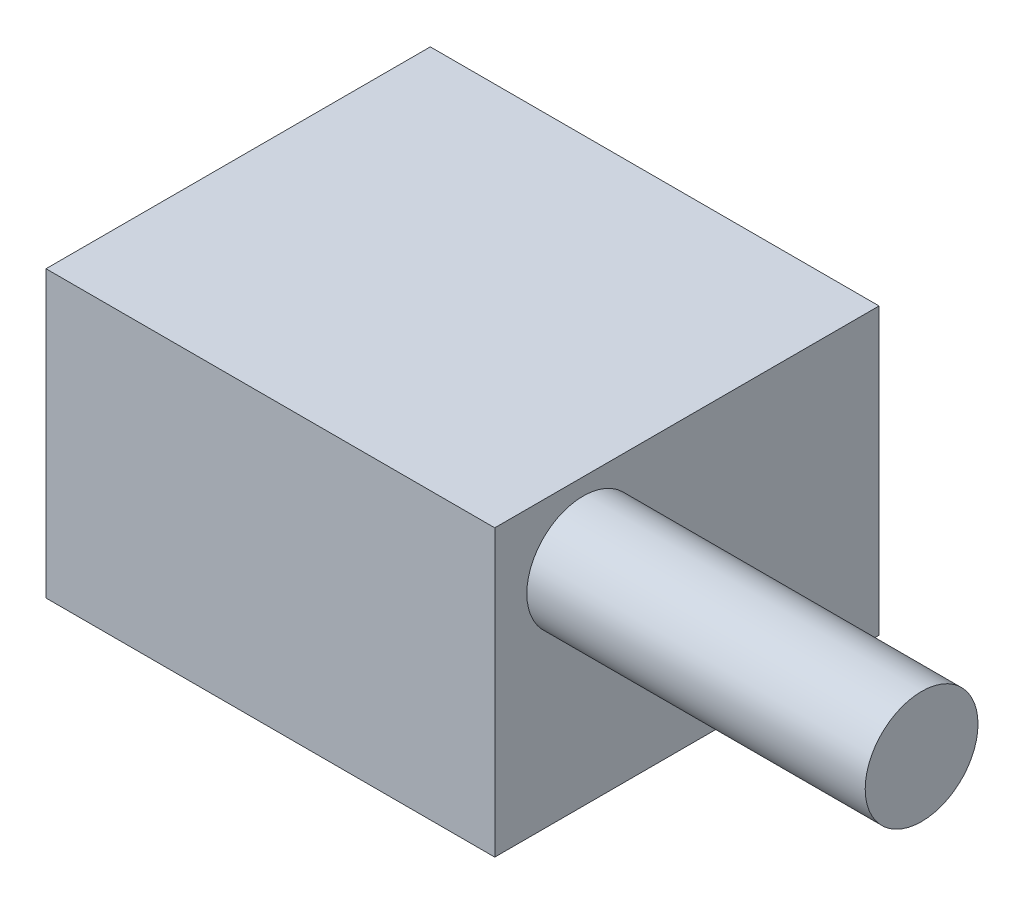
ISO-10303-21;
HEADER;
FILE_DESCRIPTION(('STEP AP214'),'2;1');
FILE_NAME('part.step','',(''),(''),'','','');
FILE_SCHEMA(('AUTOMOTIVE_DESIGN { 1 0 10303 214 1 1 1 1 }'));
ENDSEC;
DATA;
#1=APPLICATION_CONTEXT('core data for automotive mechanical design processes');
#2=APPLICATION_PROTOCOL_DEFINITION('international standard','automotive_design',2000,#1);
#3=PRODUCT_CONTEXT('',#1,'mechanical');
#4=PRODUCT('Part','Part','',(#3));
#5=PRODUCT_RELATED_PRODUCT_CATEGORY('part','',(#4));
#6=PRODUCT_DEFINITION_FORMATION('','',#4);
#7=PRODUCT_DEFINITION_CONTEXT('part definition',#1,'design');
#8=PRODUCT_DEFINITION('design','',#6,#7);
#9=PRODUCT_DEFINITION_SHAPE('','',#8);
#10=(LENGTH_UNIT() NAMED_UNIT(*) SI_UNIT(.MILLI.,.METRE.));
#11=(NAMED_UNIT(*) PLANE_ANGLE_UNIT() SI_UNIT($,.RADIAN.));
#12=(NAMED_UNIT(*) SI_UNIT($,.STERADIAN.) SOLID_ANGLE_UNIT());
#13=UNCERTAINTY_MEASURE_WITH_UNIT(LENGTH_MEASURE(1.E-05),#10,'distance_accuracy_value','');
#14=(GEOMETRIC_REPRESENTATION_CONTEXT(3) GLOBAL_UNCERTAINTY_ASSIGNED_CONTEXT((#13)) GLOBAL_UNIT_ASSIGNED_CONTEXT((#10,
#11,#12)) REPRESENTATION_CONTEXT('',''));
#15=CARTESIAN_POINT('',(0.,0.,0.));
#16=DIRECTION('',(0.,0.,1.));
#17=DIRECTION('',(1.,0.,0.));
#18=AXIS2_PLACEMENT_3D('',#15,#16,#17);
#19=CARTESIAN_POINT('',(35.3695,44.958,-30.2895));
#20=DIRECTION('',(-1.,0.,0.));
#21=DIRECTION('',(0.,0.,1.));
#22=AXIS2_PLACEMENT_3D('',#19,#20,#21);
#23=PLANE('',#22);
#24=CARTESIAN_POINT('',(35.3695,33.4416953738942,16.3448972370461));
#25=DIRECTION('',(-1.,0.,0.));
#26=DIRECTION('',(0.,0.,1.));
#27=AXIS2_PLACEMENT_3D('',#24,#25,#26);
#28=CIRCLE('',#27,8.89);
#29=CARTESIAN_POINT('',(35.3695,33.4416953738942,25.2348972370461));
#30=VERTEX_POINT('',#29);
#31=EDGE_CURVE('E11',#30,#30,#28,.F.);
#32=ORIENTED_EDGE('',*,*,#31,.F.);
#33=EDGE_LOOP('',(#32));
#34=FACE_BOUND('',#33,.T.);
#35=DIRECTION('',(0.,0.,-1.));
#36=VECTOR('',#35,1.);
#37=CARTESIAN_POINT('',(35.3695,0.,-30.2895));
#38=LINE('',#37,#36);
#39=CARTESIAN_POINT('',(35.3695,0.,30.2895));
#40=VERTEX_POINT('',#39);
#41=CARTESIAN_POINT('',(35.3695,0.,-30.2895));
#42=VERTEX_POINT('',#41);
#43=EDGE_CURVE('E103',#40,#42,#38,.T.);
#44=ORIENTED_EDGE('',*,*,#43,.T.);
#45=DIRECTION('',(0.,-1.,0.));
#46=VECTOR('',#45,1.);
#47=CARTESIAN_POINT('',(35.3695,44.958,-30.2895));
#48=LINE('',#47,#46);
#49=CARTESIAN_POINT('',(35.3695,44.958,-30.2895));
#50=VERTEX_POINT('',#49);
#51=EDGE_CURVE('E45',#50,#42,#48,.T.);
#52=ORIENTED_EDGE('',*,*,#51,.F.);
#53=DIRECTION('',(0.,0.,-1.));
#54=VECTOR('',#53,1.);
#55=CARTESIAN_POINT('',(35.3695,44.958,-30.2895));
#56=LINE('',#55,#54);
#57=CARTESIAN_POINT('',(35.3695,44.958,30.2895));
#58=VERTEX_POINT('',#57);
#59=EDGE_CURVE('E89',#58,#50,#56,.T.);
#60=ORIENTED_EDGE('',*,*,#59,.F.);
#61=DIRECTION('',(0.,-1.,0.));
#62=VECTOR('',#61,1.);
#63=CARTESIAN_POINT('',(35.3695,44.958,30.2895));
#64=LINE('',#63,#62);
#65=EDGE_CURVE('E99',#58,#40,#64,.T.);
#66=ORIENTED_EDGE('',*,*,#65,.T.);
#67=EDGE_LOOP('',(#44,#52,#60,#66));
#68=FACE_BOUND('',#67,.T.);
#69=ADVANCED_FACE('F37',(#34,#68),#23,.F.);
#70=CARTESIAN_POINT('',(-35.3695,44.958,-30.2895));
#71=DIRECTION('',(0.,0.,1.));
#72=DIRECTION('',(1.,0.,0.));
#73=AXIS2_PLACEMENT_3D('',#70,#71,#72);
#74=PLANE('',#73);
#75=DIRECTION('',(-1.,0.,0.));
#76=VECTOR('',#75,1.);
#77=CARTESIAN_POINT('',(-35.3695,0.,-30.2895));
#78=LINE('',#77,#76);
#79=CARTESIAN_POINT('',(-35.3695,0.,-30.2895));
#80=VERTEX_POINT('',#79);
#81=EDGE_CURVE('E94',#42,#80,#78,.T.);
#82=ORIENTED_EDGE('',*,*,#81,.T.);
#83=DIRECTION('',(0.,-1.,0.));
#84=VECTOR('',#83,1.);
#85=CARTESIAN_POINT('',(-35.3695,44.958,-30.2895));
#86=LINE('',#85,#84);
#87=CARTESIAN_POINT('',(-35.3695,44.958,-30.2895));
#88=VERTEX_POINT('',#87);
#89=EDGE_CURVE('E92',#88,#80,#86,.T.);
#90=ORIENTED_EDGE('',*,*,#89,.F.);
#91=DIRECTION('',(-1.,0.,0.));
#92=VECTOR('',#91,1.);
#93=CARTESIAN_POINT('',(-35.3695,44.958,-30.2895));
#94=LINE('',#93,#92);
#95=EDGE_CURVE('E84',#50,#88,#94,.T.);
#96=ORIENTED_EDGE('',*,*,#95,.F.);
#97=ORIENTED_EDGE('',*,*,#51,.T.);
#98=EDGE_LOOP('',(#82,#90,#96,#97));
#99=FACE_BOUND('',#98,.T.);
#100=ADVANCED_FACE('F93',(#99),#74,.F.);
#101=CARTESIAN_POINT('',(-35.3695,44.958,-30.2895));
#102=DIRECTION('',(1.,0.,0.));
#103=DIRECTION('',(0.,0.,-1.));
#104=AXIS2_PLACEMENT_3D('',#101,#102,#103);
#105=PLANE('',#104);
#106=DIRECTION('',(0.,0.,1.));
#107=VECTOR('',#106,1.);
#108=CARTESIAN_POINT('',(-35.3695,0.,-30.2895));
#109=LINE('',#108,#107);
#110=CARTESIAN_POINT('',(-35.3695,0.,30.2895));
#111=VERTEX_POINT('',#110);
#112=EDGE_CURVE('E70',#80,#111,#109,.T.);
#113=ORIENTED_EDGE('',*,*,#112,.T.);
#114=DIRECTION('',(0.,-1.,0.));
#115=VECTOR('',#114,1.);
#116=CARTESIAN_POINT('',(-35.3695,44.958,30.2895));
#117=LINE('',#116,#115);
#118=CARTESIAN_POINT('',(-35.3695,44.958,30.2895));
#119=VERTEX_POINT('',#118);
#120=EDGE_CURVE('E95',#119,#111,#117,.T.);
#121=ORIENTED_EDGE('',*,*,#120,.F.);
#122=DIRECTION('',(0.,0.,1.));
#123=VECTOR('',#122,1.);
#124=CARTESIAN_POINT('',(-35.3695,44.958,-30.2895));
#125=LINE('',#124,#123);
#126=EDGE_CURVE('E87',#88,#119,#125,.T.);
#127=ORIENTED_EDGE('',*,*,#126,.F.);
#128=ORIENTED_EDGE('',*,*,#89,.T.);
#129=EDGE_LOOP('',(#113,#121,#127,#128));
#130=FACE_BOUND('',#129,.T.);
#131=ADVANCED_FACE('F97',(#130),#105,.F.);
#132=CARTESIAN_POINT('',(-35.3695,44.958,30.2895));
#133=DIRECTION('',(0.,0.,-1.));
#134=DIRECTION('',(-1.,0.,0.));
#135=AXIS2_PLACEMENT_3D('',#132,#133,#134);
#136=PLANE('',#135);
#137=DIRECTION('',(1.,0.,0.));
#138=VECTOR('',#137,1.);
#139=CARTESIAN_POINT('',(-35.3695,0.,30.2895));
#140=LINE('',#139,#138);
#141=EDGE_CURVE('E76',#111,#40,#140,.T.);
#142=ORIENTED_EDGE('',*,*,#141,.T.);
#143=ORIENTED_EDGE('',*,*,#65,.F.);
#144=DIRECTION('',(1.,0.,0.));
#145=VECTOR('',#144,1.);
#146=CARTESIAN_POINT('',(-35.3695,44.958,30.2895));
#147=LINE('',#146,#145);
#148=EDGE_CURVE('E53',#119,#58,#147,.T.);
#149=ORIENTED_EDGE('',*,*,#148,.F.);
#150=ORIENTED_EDGE('',*,*,#120,.T.);
#151=EDGE_LOOP('',(#142,#143,#149,#150));
#152=FACE_BOUND('',#151,.T.);
#153=ADVANCED_FACE('F125',(#152),#136,.F.);
#154=CARTESIAN_POINT('',(0.,44.958,0.));
#155=DIRECTION('',(0.,1.,0.));
#156=DIRECTION('',(0.,0.,1.));
#157=AXIS2_PLACEMENT_3D('',#154,#155,#156);
#158=PLANE('',#157);
#159=ORIENTED_EDGE('',*,*,#59,.T.);
#160=ORIENTED_EDGE('',*,*,#95,.T.);
#161=ORIENTED_EDGE('',*,*,#126,.T.);
#162=ORIENTED_EDGE('',*,*,#148,.T.);
#163=EDGE_LOOP('',(#159,#160,#161,#162));
#164=FACE_BOUND('',#163,.T.);
#165=ADVANCED_FACE('F85',(#164),#158,.T.);
#166=CARTESIAN_POINT('',(0.,0.,0.));
#167=DIRECTION('',(0.,1.,0.));
#168=DIRECTION('',(0.,0.,1.));
#169=AXIS2_PLACEMENT_3D('',#166,#167,#168);
#170=PLANE('',#169);
#171=ORIENTED_EDGE('',*,*,#43,.F.);
#172=ORIENTED_EDGE('',*,*,#141,.F.);
#173=ORIENTED_EDGE('',*,*,#112,.F.);
#174=ORIENTED_EDGE('',*,*,#81,.F.);
#175=EDGE_LOOP('',(#171,#172,#173,#174));
#176=FACE_BOUND('',#175,.T.);
#177=ADVANCED_FACE('F114',(#176),#170,.F.);
#178=CARTESIAN_POINT('',(88.7095,33.4416953738942,16.3448972370461));
#179=DIRECTION('',(-1.,0.,0.));
#180=DIRECTION('',(0.,0.,1.));
#181=AXIS2_PLACEMENT_3D('',#178,#179,#180);
#182=CYLINDRICAL_SURFACE('',#181,8.89);
#183=CARTESIAN_POINT('',(88.7095,33.4416953738942,16.3448972370461));
#184=DIRECTION('',(1.,0.,0.));
#185=DIRECTION('',(0.,0.,-1.));
#186=AXIS2_PLACEMENT_3D('',#183,#184,#185);
#187=CIRCLE('',#186,8.89);
#188=CARTESIAN_POINT('',(88.7095,33.4416953738942,7.45489723704607));
#189=VERTEX_POINT('',#188);
#190=EDGE_CURVE('E106',#189,#189,#187,.T.);
#191=ORIENTED_EDGE('',*,*,#190,.F.);
#192=EDGE_LOOP('',(#191));
#193=FACE_BOUND('',#192,.T.);
#194=ORIENTED_EDGE('',*,*,#31,.T.);
#195=EDGE_LOOP('',(#194));
#196=FACE_BOUND('',#195,.T.);
#197=ADVANCED_FACE('F116',(#193,#196),#182,.T.);
#198=CARTESIAN_POINT('',(88.7095,33.4416953738942,16.3448972370461));
#199=DIRECTION('',(1.,0.,0.));
#200=DIRECTION('',(0.,0.,-1.));
#201=AXIS2_PLACEMENT_3D('',#198,#199,#200);
#202=PLANE('',#201);
#203=ORIENTED_EDGE('',*,*,#190,.T.);
#204=EDGE_LOOP('',(#203));
#205=FACE_BOUND('',#204,.T.);
#206=ADVANCED_FACE('F122',(#205),#202,.T.);
#207=CLOSED_SHELL('',(#69,#100,#131,#153,#165,#177,#197,#206));
#208=MANIFOLD_SOLID_BREP('B2',#207);
#209=ADVANCED_BREP_SHAPE_REPRESENTATION('',(#18,#208),#14);
#210=SHAPE_DEFINITION_REPRESENTATION(#9,#209);
ENDSEC;
END-ISO-10303-21;
